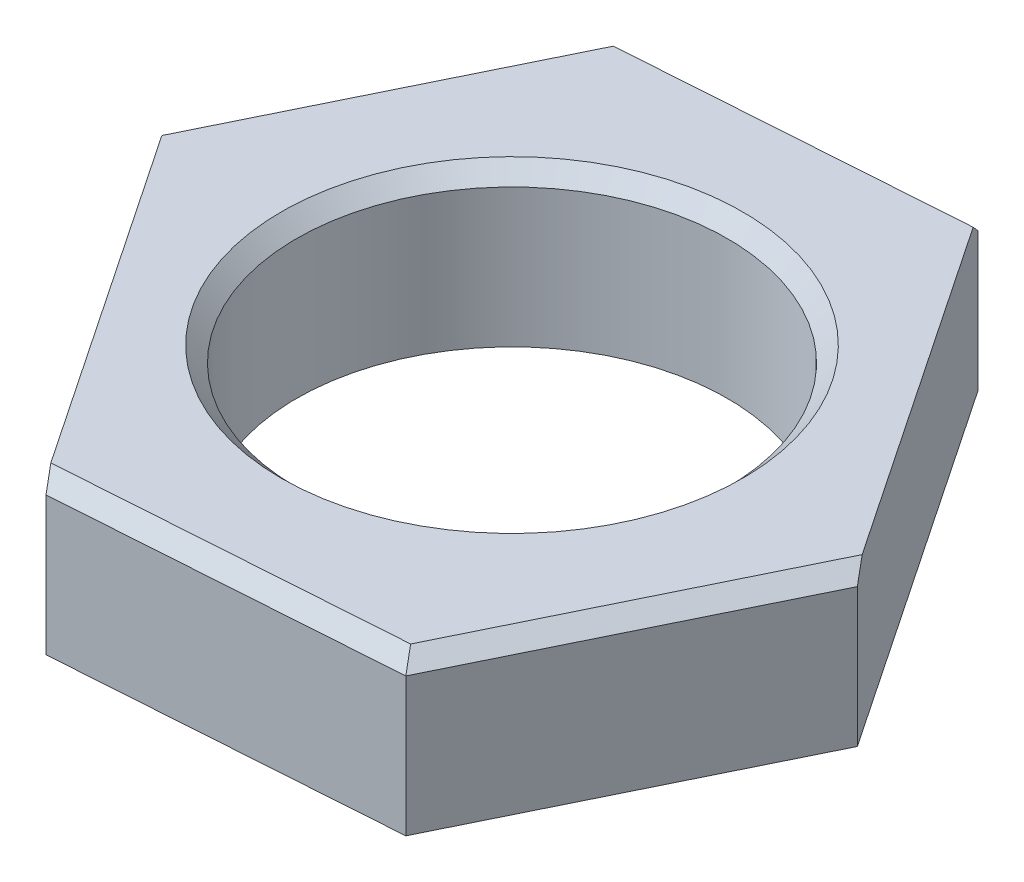
ISO-10303-21;
HEADER;
FILE_DESCRIPTION(('STEP AP214'),'2;1');
FILE_NAME('part.step','',(''),(''),'','','');
FILE_SCHEMA(('AUTOMOTIVE_DESIGN { 1 0 10303 214 1 1 1 1 }'));
ENDSEC;
DATA;
#1=APPLICATION_CONTEXT('core data for automotive mechanical design processes');
#2=APPLICATION_PROTOCOL_DEFINITION('international standard','automotive_design',2000,#1);
#3=PRODUCT_CONTEXT('',#1,'mechanical');
#4=PRODUCT('Part','Part','',(#3));
#5=PRODUCT_RELATED_PRODUCT_CATEGORY('part','',(#4));
#6=PRODUCT_DEFINITION_FORMATION('','',#4);
#7=PRODUCT_DEFINITION_CONTEXT('part definition',#1,'design');
#8=PRODUCT_DEFINITION('design','',#6,#7);
#9=PRODUCT_DEFINITION_SHAPE('','',#8);
#10=(LENGTH_UNIT() NAMED_UNIT(*) SI_UNIT(.MILLI.,.METRE.));
#11=(NAMED_UNIT(*) PLANE_ANGLE_UNIT() SI_UNIT($,.RADIAN.));
#12=(NAMED_UNIT(*) SI_UNIT($,.STERADIAN.) SOLID_ANGLE_UNIT());
#13=UNCERTAINTY_MEASURE_WITH_UNIT(LENGTH_MEASURE(1.E-05),#10,'distance_accuracy_value','');
#14=(GEOMETRIC_REPRESENTATION_CONTEXT(3) GLOBAL_UNCERTAINTY_ASSIGNED_CONTEXT((#13)) GLOBAL_UNIT_ASSIGNED_CONTEXT((#10,
#11,#12)) REPRESENTATION_CONTEXT('',''));
#15=CARTESIAN_POINT('',(0.,0.,0.));
#16=DIRECTION('',(0.,0.,1.));
#17=DIRECTION('',(1.,0.,0.));
#18=AXIS2_PLACEMENT_3D('',#15,#16,#17);
#19=CARTESIAN_POINT('',(0.,5.,0.));
#20=DIRECTION('',(0.,1.,0.));
#21=DIRECTION('',(0.,0.,1.));
#22=AXIS2_PLACEMENT_3D('',#19,#20,#21);
#23=PLANE('',#22);
#24=DIRECTION('',(0.558084773293205,0.,0.829783939238566));
#25=VECTOR('',#24,1.);
#26=CARTESIAN_POINT('',(3.39605384240198,5.,-11.9731076434061));
#27=LINE('',#26,#25);
#28=CARTESIAN_POINT('',(4.17752789071451,5.,-10.8111791242046));
#29=VERTEX_POINT('',#28);
#30=CARTESIAN_POINT('',(11.5883669548182,5.,0.207568431633649));
#31=VERTEX_POINT('',#30);
#32=EDGE_CURVE('E49',#29,#31,#27,.T.);
#33=ORIENTED_EDGE('',*,*,#32,.F.);
#34=DIRECTION('',(-0.997656357679524,0.,0.0684236215179122));
#35=VECTOR('',#34,1.);
#36=CARTESIAN_POINT('',(-7.05441685925327,5.,-10.0408433963098));
#37=LINE('',#36,#35);
#38=CARTESIAN_POINT('',(-6.76641827592077,5.,-10.0605955944609));
#39=VERTEX_POINT('',#38);
#40=EDGE_CURVE('E117',#29,#39,#37,.T.);
#41=ORIENTED_EDGE('',*,*,#40,.T.);
#42=DIRECTION('',(-0.439571584386318,0.,0.898207560756478));
#43=VECTOR('',#42,1.);
#44=CARTESIAN_POINT('',(-12.2228338862521,5.,1.08888251084366));
#45=LINE('',#44,#43);
#46=CARTESIAN_POINT('',(-11.5883669548182,5.,-0.207568431633654));
#47=VERTEX_POINT('',#46);
#48=EDGE_CURVE('E126',#39,#47,#45,.T.);
#49=ORIENTED_EDGE('',*,*,#48,.T.);
#50=DIRECTION('',(-0.558084773293205,0.,-0.829783939238566));
#51=VECTOR('',#50,1.);
#52=CARTESIAN_POINT('',(-12.3698410031308,5.,-1.36949695083516));
#53=LINE('',#52,#51);
#54=CARTESIAN_POINT('',(-4.17752789071451,5.,10.8111791242046));
#55=VERTEX_POINT('',#54);
#56=EDGE_CURVE('E152',#55,#47,#53,.T.);
#57=ORIENTED_EDGE('',*,*,#56,.F.);
#58=DIRECTION('',(0.997656357679524,0.,-0.0684236215179123));
#59=VECTOR('',#58,1.);
#60=CARTESIAN_POINT('',(7.05441685925327,5.,10.0408433963098));
#61=LINE('',#60,#59);
#62=CARTESIAN_POINT('',(6.76641827592076,5.,10.0605955944609));
#63=VERTEX_POINT('',#62);
#64=EDGE_CURVE('E130',#55,#63,#61,.T.);
#65=ORIENTED_EDGE('',*,*,#64,.T.);
#66=DIRECTION('',(0.439571584386318,0.,-0.898207560756478));
#67=VECTOR('',#66,1.);
#68=CARTESIAN_POINT('',(12.2228338862521,5.,-1.08888251084367));
#69=LINE('',#68,#67);
#70=EDGE_CURVE('E120',#63,#31,#69,.T.);
#71=ORIENTED_EDGE('',*,*,#70,.T.);
#72=EDGE_LOOP('',(#33,#41,#49,#57,#65,#71));
#73=FACE_BOUND('',#72,.T.);
#74=CARTESIAN_POINT('',(0.,5.,0.));
#75=DIRECTION('',(0.,1.,0.));
#76=DIRECTION('',(0.,0.,1.));
#77=AXIS2_PLACEMENT_3D('',#74,#75,#76);
#78=CIRCLE('',#77,7.5);
#79=CARTESIAN_POINT('',(0.,5.,7.5));
#80=VERTEX_POINT('',#79);
#81=EDGE_CURVE('E128',#80,#80,#78,.F.);
#82=ORIENTED_EDGE('',*,*,#81,.T.);
#83=EDGE_LOOP('',(#82));
#84=FACE_BOUND('',#83,.T.);
#85=ADVANCED_FACE('F35',(#73,#84),#23,.T.);
#86=CARTESIAN_POINT('',(0.,0.,0.));
#87=DIRECTION('',(0.,1.,0.));
#88=DIRECTION('',(0.,0.,1.));
#89=AXIS2_PLACEMENT_3D('',#86,#87,#88);
#90=PLANE('',#89);
#91=DIRECTION('',(-0.997656357679524,0.,0.0684236215179122));
#92=VECTOR('',#91,1.);
#93=CARTESIAN_POINT('',(5.58330899661814,0.,-11.4087682938001));
#94=LINE('',#93,#92);
#95=CARTESIAN_POINT('',(3.85531749662305,0.,-11.2902551048932));
#96=VERTEX_POINT('',#95);
#97=CARTESIAN_POINT('',(-7.08862867001223,0.,-10.5396715751496));
#98=VERTEX_POINT('',#97);
#99=EDGE_CURVE('E174',#96,#98,#94,.T.);
#100=ORIENTED_EDGE('',*,*,#99,.F.);
#101=DIRECTION('',(0.558084773293205,0.,0.829783939238566));
#102=VECTOR('',#101,1.);
#103=CARTESIAN_POINT('',(3.39605384240198,0.,-11.9731076434061));
#104=LINE('',#103,#102);
#105=CARTESIAN_POINT('',(11.9105773489097,0.,0.686644412322263));
#106=VERTEX_POINT('',#105);
#107=EDGE_CURVE('E121',#96,#106,#104,.T.);
#108=ORIENTED_EDGE('',*,*,#107,.T.);
#109=DIRECTION('',(0.439571584386318,0.,-0.898207560756478));
#110=VECTOR('',#109,1.);
#111=CARTESIAN_POINT('',(7.08862867001223,0.,10.5396715751496));
#112=LINE('',#111,#110);
#113=CARTESIAN_POINT('',(7.08862867001223,0.,10.5396715751496));
#114=VERTEX_POINT('',#113);
#115=EDGE_CURVE('E176',#114,#106,#112,.T.);
#116=ORIENTED_EDGE('',*,*,#115,.F.);
#117=DIRECTION('',(0.997656357679524,0.,-0.0684236215179123));
#118=VECTOR('',#117,1.);
#119=CARTESIAN_POINT('',(-5.58330899661814,0.,11.4087682938001));
#120=LINE('',#119,#118);
#121=CARTESIAN_POINT('',(-3.85531749662305,0.,11.2902551048932));
#122=VERTEX_POINT('',#121);
#123=EDGE_CURVE('E179',#122,#114,#120,.T.);
#124=ORIENTED_EDGE('',*,*,#123,.F.);
#125=DIRECTION('',(-0.558084773293205,0.,-0.829783939238566));
#126=VECTOR('',#125,1.);
#127=CARTESIAN_POINT('',(-12.3698410031308,0.,-1.36949695083516));
#128=LINE('',#127,#126);
#129=CARTESIAN_POINT('',(-11.9105773489097,0.,-0.68664441232226));
#130=VERTEX_POINT('',#129);
#131=EDGE_CURVE('E157',#122,#130,#128,.T.);
#132=ORIENTED_EDGE('',*,*,#131,.T.);
#133=DIRECTION('',(-0.439571584386318,0.,0.898207560756478));
#134=VECTOR('',#133,1.);
#135=CARTESIAN_POINT('',(-7.08862867001223,0.,-10.5396715751496));
#136=LINE('',#135,#134);
#137=EDGE_CURVE('E171',#98,#130,#136,.T.);
#138=ORIENTED_EDGE('',*,*,#137,.F.);
#139=EDGE_LOOP('',(#100,#108,#116,#124,#132,#138));
#140=FACE_BOUND('',#139,.T.);
#141=CARTESIAN_POINT('',(0.,0.,0.));
#142=DIRECTION('',(0.,1.,0.));
#143=DIRECTION('',(0.,0.,1.));
#144=AXIS2_PLACEMENT_3D('',#141,#142,#143);
#145=CIRCLE('',#144,7.);
#146=CARTESIAN_POINT('',(0.,0.,7.));
#147=VERTEX_POINT('',#146);
#148=EDGE_CURVE('E149',#147,#147,#145,.T.);
#149=ORIENTED_EDGE('',*,*,#148,.T.);
#150=EDGE_LOOP('',(#149));
#151=FACE_BOUND('',#150,.T.);
#152=ADVANCED_FACE('F197',(#140,#151),#90,.F.);
#153=CARTESIAN_POINT('',(-5.58330899661814,5.,11.4087682938001));
#154=DIRECTION('',(-0.0684236215179123,0.,-0.997656357679524));
#155=DIRECTION('',(-0.997656357679524,0.,0.0684236215179123));
#156=AXIS2_PLACEMENT_3D('',#153,#154,#155);
#157=PLANE('',#156);
#158=DIRECTION('',(-0.997656357679524,0.,0.0684236215179123));
#159=VECTOR('',#158,1.);
#160=CARTESIAN_POINT('',(-5.58330899661814,4.5,11.4087682938001));
#161=LINE('',#160,#159);
#162=CARTESIAN_POINT('',(7.08862867001223,4.5,10.5396715751496));
#163=VERTEX_POINT('',#162);
#164=CARTESIAN_POINT('',(-3.85531749662305,4.5,11.2902551048932));
#165=VERTEX_POINT('',#164);
#166=EDGE_CURVE('E142',#163,#165,#161,.T.);
#167=ORIENTED_EDGE('',*,*,#166,.T.);
#168=DIRECTION('',(0.,-1.,0.));
#169=VECTOR('',#168,1.);
#170=CARTESIAN_POINT('',(-3.85531749662305,5.,11.2902551048932));
#171=LINE('',#170,#169);
#172=EDGE_CURVE('E57',#165,#122,#171,.T.);
#173=ORIENTED_EDGE('',*,*,#172,.T.);
#174=ORIENTED_EDGE('',*,*,#123,.T.);
#175=DIRECTION('',(0.,-1.,0.));
#176=VECTOR('',#175,1.);
#177=CARTESIAN_POINT('',(7.08862867001223,5.,10.5396715751496));
#178=LINE('',#177,#176);
#179=EDGE_CURVE('E163',#163,#114,#178,.T.);
#180=ORIENTED_EDGE('',*,*,#179,.F.);
#181=EDGE_LOOP('',(#167,#173,#174,#180));
#182=FACE_BOUND('',#181,.T.);
#183=ADVANCED_FACE('F206',(#182),#157,.F.);
#184=CARTESIAN_POINT('',(7.08862867001223,5.,10.5396715751496));
#185=DIRECTION('',(-0.898207560756478,0.,-0.439571584386318));
#186=DIRECTION('',(-0.439571584386318,0.,0.898207560756478));
#187=AXIS2_PLACEMENT_3D('',#184,#185,#186);
#188=PLANE('',#187);
#189=ORIENTED_EDGE('',*,*,#115,.T.);
#190=DIRECTION('',(0.,1.,0.));
#191=VECTOR('',#190,1.);
#192=CARTESIAN_POINT('',(11.9105773489097,5.,0.686644412322263));
#193=LINE('',#192,#191);
#194=CARTESIAN_POINT('',(11.9105773489097,4.5,0.686644412322262));
#195=VERTEX_POINT('',#194);
#196=EDGE_CURVE('E111',#106,#195,#193,.T.);
#197=ORIENTED_EDGE('',*,*,#196,.T.);
#198=DIRECTION('',(-0.439571584386318,0.,0.898207560756478));
#199=VECTOR('',#198,1.);
#200=CARTESIAN_POINT('',(7.08862867001223,4.5,10.5396715751496));
#201=LINE('',#200,#199);
#202=EDGE_CURVE('E140',#195,#163,#201,.T.);
#203=ORIENTED_EDGE('',*,*,#202,.T.);
#204=ORIENTED_EDGE('',*,*,#179,.T.);
#205=EDGE_LOOP('',(#189,#197,#203,#204));
#206=FACE_BOUND('',#205,.T.);
#207=ADVANCED_FACE('F202',(#206),#188,.F.);
#208=CARTESIAN_POINT('',(5.58330899661814,5.,-11.4087682938001));
#209=DIRECTION('',(0.0684236215179122,0.,0.997656357679524));
#210=DIRECTION('',(0.997656357679524,0.,-0.0684236215179122));
#211=AXIS2_PLACEMENT_3D('',#208,#209,#210);
#212=PLANE('',#211);
#213=DIRECTION('',(0.997656357679524,0.,-0.0684236215179122));
#214=VECTOR('',#213,1.);
#215=CARTESIAN_POINT('',(5.58330899661814,4.5,-11.4087682938001));
#216=LINE('',#215,#214);
#217=CARTESIAN_POINT('',(-7.08862867001223,4.5,-10.5396715751496));
#218=VERTEX_POINT('',#217);
#219=CARTESIAN_POINT('',(3.85531749662305,4.5,-11.2902551048932));
#220=VERTEX_POINT('',#219);
#221=EDGE_CURVE('E138',#218,#220,#216,.T.);
#222=ORIENTED_EDGE('',*,*,#221,.T.);
#223=DIRECTION('',(0.,-1.,0.));
#224=VECTOR('',#223,1.);
#225=CARTESIAN_POINT('',(3.85531749662305,5.,-11.2902551048932));
#226=LINE('',#225,#224);
#227=EDGE_CURVE('E106',#220,#96,#226,.T.);
#228=ORIENTED_EDGE('',*,*,#227,.T.);
#229=ORIENTED_EDGE('',*,*,#99,.T.);
#230=DIRECTION('',(0.,-1.,0.));
#231=VECTOR('',#230,1.);
#232=CARTESIAN_POINT('',(-7.08862867001223,5.,-10.5396715751496));
#233=LINE('',#232,#231);
#234=EDGE_CURVE('E168',#218,#98,#233,.T.);
#235=ORIENTED_EDGE('',*,*,#234,.F.);
#236=EDGE_LOOP('',(#222,#228,#229,#235));
#237=FACE_BOUND('',#236,.T.);
#238=ADVANCED_FACE('F231',(#237),#212,.F.);
#239=CARTESIAN_POINT('',(-7.08862867001223,5.,-10.5396715751496));
#240=DIRECTION('',(0.898207560756478,0.,0.439571584386318));
#241=DIRECTION('',(0.439571584386318,0.,-0.898207560756478));
#242=AXIS2_PLACEMENT_3D('',#239,#240,#241);
#243=PLANE('',#242);
#244=ORIENTED_EDGE('',*,*,#137,.T.);
#245=DIRECTION('',(0.,1.,0.));
#246=VECTOR('',#245,1.);
#247=CARTESIAN_POINT('',(-11.9105773489097,5.,-0.686644412322263));
#248=LINE('',#247,#246);
#249=CARTESIAN_POINT('',(-11.9105773489097,4.5,-0.686644412322262));
#250=VERTEX_POINT('',#249);
#251=EDGE_CURVE('E148',#130,#250,#248,.T.);
#252=ORIENTED_EDGE('',*,*,#251,.T.);
#253=DIRECTION('',(0.439571584386318,0.,-0.898207560756478));
#254=VECTOR('',#253,1.);
#255=CARTESIAN_POINT('',(-7.08862867001223,4.5,-10.5396715751496));
#256=LINE('',#255,#254);
#257=EDGE_CURVE('E136',#250,#218,#256,.T.);
#258=ORIENTED_EDGE('',*,*,#257,.T.);
#259=ORIENTED_EDGE('',*,*,#234,.T.);
#260=EDGE_LOOP('',(#244,#252,#258,#259));
#261=FACE_BOUND('',#260,.T.);
#262=ADVANCED_FACE('F228',(#261),#243,.F.);
#263=CARTESIAN_POINT('',(0.,5.,0.));
#264=DIRECTION('',(0.,-1.,0.));
#265=DIRECTION('',(0.,0.,-1.));
#266=AXIS2_PLACEMENT_3D('',#263,#264,#265);
#267=CYLINDRICAL_SURFACE('',#266,7.);
#268=CARTESIAN_POINT('',(0.,4.5,0.));
#269=DIRECTION('',(0.,1.,0.));
#270=DIRECTION('',(0.,0.,1.));
#271=AXIS2_PLACEMENT_3D('',#268,#269,#270);
#272=CIRCLE('',#271,7.);
#273=CARTESIAN_POINT('',(0.,4.5,7.));
#274=VERTEX_POINT('',#273);
#275=EDGE_CURVE('E161',#274,#274,#272,.T.);
#276=ORIENTED_EDGE('',*,*,#275,.T.);
#277=EDGE_LOOP('',(#276));
#278=FACE_BOUND('',#277,.T.);
#279=ORIENTED_EDGE('',*,*,#148,.F.);
#280=EDGE_LOOP('',(#279));
#281=FACE_BOUND('',#280,.T.);
#282=ADVANCED_FACE('F225',(#278,#281),#267,.F.);
#283=CARTESIAN_POINT('',(0.,4.5,0.));
#284=DIRECTION('',(0.,1.,0.));
#285=DIRECTION('',(0.,0.,1.));
#286=AXIS2_PLACEMENT_3D('',#283,#284,#285);
#287=CONICAL_SURFACE('',#286,7.,0.785398163397452);
#288=ORIENTED_EDGE('',*,*,#81,.F.);
#289=EDGE_LOOP('',(#288));
#290=FACE_BOUND('',#289,.T.);
#291=ORIENTED_EDGE('',*,*,#275,.F.);
#292=EDGE_LOOP('',(#291));
#293=FACE_BOUND('',#292,.T.);
#294=ADVANCED_FACE('F217',(#290,#293),#287,.F.);
#295=CARTESIAN_POINT('',(-0.718448025938082,5.,-10.475391755635));
#296=DIRECTION('',(-0.0483828067686576,0.707106781186546,-0.705449575809065));
#297=DIRECTION('',(0.997656357679524,0.,-0.0684236215179122));
#298=AXIS2_PLACEMENT_3D('',#295,#296,#297);
#299=PLANE('',#298);
#300=DIRECTION('',(0.42187243446448,0.654653670707979,0.627257698611649));
#301=VECTOR('',#300,1.);
#302=CARTESIAN_POINT('',(3.39501693363525,3.78571428571429,-11.9746493630198));
#303=LINE('',#302,#301);
#304=EDGE_CURVE('E103',#220,#29,#303,.T.);
#305=ORIENTED_EDGE('',*,*,#304,.F.);
#306=ORIENTED_EDGE('',*,*,#221,.F.);
#307=DIRECTION('',(0.421872434464477,0.65465367070798,0.62725769861165));
#308=VECTOR('',#307,1.);
#309=CARTESIAN_POINT('',(-5.79978709364639,6.5,-8.62336765239511));
#310=LINE('',#309,#308);
#311=EDGE_CURVE('E124',#39,#218,#310,.F.);
#312=ORIENTED_EDGE('',*,*,#311,.F.);
#313=ORIENTED_EDGE('',*,*,#40,.F.);
#314=EDGE_LOOP('',(#305,#306,#312,#313));
#315=FACE_BOUND('',#314,.T.);
#316=ADVANCED_FACE('F37',(#315),#299,.T.);
#317=CARTESIAN_POINT('',(9.43117938794306,5.,4.61550163605636));
#318=DIRECTION('',(0.635128657123934,0.707106781186547,0.31082404813648));
#319=DIRECTION('',(-0.439571584386318,0.,0.898207560756478));
#320=AXIS2_PLACEMENT_3D('',#317,#318,#319);
#321=PLANE('',#320);
#322=DIRECTION('',(0.421872434464481,-0.654653670707977,0.62725769861165));
#323=VECTOR('',#322,1.);
#324=CARTESIAN_POINT('',(12.3708779118975,3.78571428571429,1.37103867044885));
#325=LINE('',#324,#323);
#326=EDGE_CURVE('E11',#31,#195,#325,.T.);
#327=ORIENTED_EDGE('',*,*,#326,.F.);
#328=ORIENTED_EDGE('',*,*,#70,.F.);
#329=DIRECTION('',(-0.421872434464486,0.654653670707979,-0.627257698611644));
#330=VECTOR('',#329,1.);
#331=CARTESIAN_POINT('',(5.79978709364634,6.50000000000003,8.62336765239509));
#332=LINE('',#331,#330);
#333=EDGE_CURVE('E145',#163,#63,#332,.T.);
#334=ORIENTED_EDGE('',*,*,#333,.F.);
#335=ORIENTED_EDGE('',*,*,#202,.F.);
#336=EDGE_LOOP('',(#327,#328,#334,#335));
#337=FACE_BOUND('',#336,.T.);
#338=ADVANCED_FACE('F208',(#337),#321,.T.);
#339=CARTESIAN_POINT('',(-9.43117938794307,5.,-4.61550163605636));
#340=DIRECTION('',(-0.635128657123937,0.707106781186544,-0.310824048136482));
#341=DIRECTION('',(0.439571584386318,0.,-0.898207560756478));
#342=AXIS2_PLACEMENT_3D('',#339,#340,#341);
#343=PLANE('',#342);
#344=DIRECTION('',(-0.421872434464479,-0.654653670707981,-0.627257698611647));
#345=VECTOR('',#344,1.);
#346=CARTESIAN_POINT('',(-12.3708779118975,3.78571428571429,-1.37103867044884));
#347=LINE('',#346,#345);
#348=EDGE_CURVE('E185',#47,#250,#347,.T.);
#349=ORIENTED_EDGE('',*,*,#348,.F.);
#350=ORIENTED_EDGE('',*,*,#48,.F.);
#351=ORIENTED_EDGE('',*,*,#311,.T.);
#352=ORIENTED_EDGE('',*,*,#257,.F.);
#353=EDGE_LOOP('',(#349,#350,#351,#352));
#354=FACE_BOUND('',#353,.T.);
#355=ADVANCED_FACE('F210',(#354),#343,.T.);
#356=CARTESIAN_POINT('',(0.718448025938082,5.,10.4753917556351));
#357=DIRECTION('',(0.0483828067686578,0.707106781186543,0.705449575809067));
#358=DIRECTION('',(-0.997656357679524,0.,0.0684236215179123));
#359=AXIS2_PLACEMENT_3D('',#356,#357,#358);
#360=PLANE('',#359);
#361=DIRECTION('',(-0.421872434464479,0.654653670707981,-0.627257698611647));
#362=VECTOR('',#361,1.);
#363=CARTESIAN_POINT('',(-3.39501693363525,3.78571428571429,11.9746493630198));
#364=LINE('',#363,#362);
#365=EDGE_CURVE('E43',#165,#55,#364,.T.);
#366=ORIENTED_EDGE('',*,*,#365,.F.);
#367=ORIENTED_EDGE('',*,*,#166,.F.);
#368=ORIENTED_EDGE('',*,*,#333,.T.);
#369=ORIENTED_EDGE('',*,*,#64,.F.);
#370=EDGE_LOOP('',(#366,#367,#368,#369));
#371=FACE_BOUND('',#370,.T.);
#372=ADVANCED_FACE('F159',(#371),#360,.T.);
#373=CARTESIAN_POINT('',(-12.3698410031308,0.,-1.36949695083516));
#374=DIRECTION('',(0.829783939238566,0.,-0.558084773293205));
#375=DIRECTION('',(-0.558084773293205,0.,-0.829783939238566));
#376=AXIS2_PLACEMENT_3D('',#373,#374,#375);
#377=PLANE('',#376);
#378=ORIENTED_EDGE('',*,*,#131,.F.);
#379=ORIENTED_EDGE('',*,*,#172,.F.);
#380=ORIENTED_EDGE('',*,*,#365,.T.);
#381=ORIENTED_EDGE('',*,*,#56,.T.);
#382=ORIENTED_EDGE('',*,*,#348,.T.);
#383=ORIENTED_EDGE('',*,*,#251,.F.);
#384=EDGE_LOOP('',(#378,#379,#380,#381,#382,#383));
#385=FACE_BOUND('',#384,.T.);
#386=ADVANCED_FACE('F151',(#385),#377,.F.);
#387=CARTESIAN_POINT('',(3.39605384240198,0.,-11.9731076434061));
#388=DIRECTION('',(-0.829783939238566,0.,0.558084773293205));
#389=DIRECTION('',(0.558084773293205,0.,0.829783939238566));
#390=AXIS2_PLACEMENT_3D('',#387,#388,#389);
#391=PLANE('',#390);
#392=ORIENTED_EDGE('',*,*,#304,.T.);
#393=ORIENTED_EDGE('',*,*,#32,.T.);
#394=ORIENTED_EDGE('',*,*,#326,.T.);
#395=ORIENTED_EDGE('',*,*,#196,.F.);
#396=ORIENTED_EDGE('',*,*,#107,.F.);
#397=ORIENTED_EDGE('',*,*,#227,.F.);
#398=EDGE_LOOP('',(#392,#393,#394,#395,#396,#397));
#399=FACE_BOUND('',#398,.T.);
#400=ADVANCED_FACE('F104',(#399),#391,.F.);
#401=CLOSED_SHELL('',(#85,#152,#183,#207,#238,#262,#282,#294,#316,#338,#355,#372,#386,#400));
#402=MANIFOLD_SOLID_BREP('B2',#401);
#403=ADVANCED_BREP_SHAPE_REPRESENTATION('',(#18,#402),#14);
#404=SHAPE_DEFINITION_REPRESENTATION(#9,#403);
ENDSEC;
END-ISO-10303-21;
